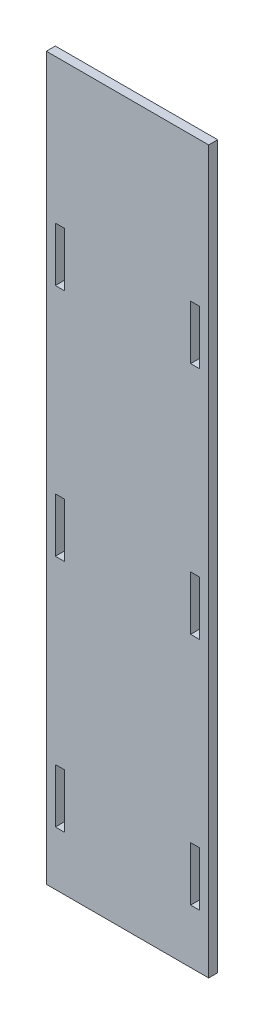
ISO-10303-21;
HEADER;
FILE_DESCRIPTION(('STEP AP214'),'2;1');
FILE_NAME('part.step','',(''),(''),'','','');
FILE_SCHEMA(('AUTOMOTIVE_DESIGN { 1 0 10303 214 1 1 1 1 }'));
ENDSEC;
DATA;
#1=APPLICATION_CONTEXT('core data for automotive mechanical design processes');
#2=APPLICATION_PROTOCOL_DEFINITION('international standard','automotive_design',2000,#1);
#3=PRODUCT_CONTEXT('',#1,'mechanical');
#4=PRODUCT('Part','Part','',(#3));
#5=PRODUCT_RELATED_PRODUCT_CATEGORY('part','',(#4));
#6=PRODUCT_DEFINITION_FORMATION('','',#4);
#7=PRODUCT_DEFINITION_CONTEXT('part definition',#1,'design');
#8=PRODUCT_DEFINITION('design','',#6,#7);
#9=PRODUCT_DEFINITION_SHAPE('','',#8);
#10=(LENGTH_UNIT() NAMED_UNIT(*) SI_UNIT(.MILLI.,.METRE.));
#11=(NAMED_UNIT(*) PLANE_ANGLE_UNIT() SI_UNIT($,.RADIAN.));
#12=(NAMED_UNIT(*) SI_UNIT($,.STERADIAN.) SOLID_ANGLE_UNIT());
#13=UNCERTAINTY_MEASURE_WITH_UNIT(LENGTH_MEASURE(1.E-05),#10,'distance_accuracy_value','');
#14=(GEOMETRIC_REPRESENTATION_CONTEXT(3) GLOBAL_UNCERTAINTY_ASSIGNED_CONTEXT((#13)) GLOBAL_UNIT_ASSIGNED_CONTEXT((#10,
#11,#12)) REPRESENTATION_CONTEXT('',''));
#15=CARTESIAN_POINT('',(0.,0.,0.));
#16=DIRECTION('',(0.,0.,1.));
#17=DIRECTION('',(1.,0.,0.));
#18=AXIS2_PLACEMENT_3D('',#15,#16,#17);
#19=CARTESIAN_POINT('',(0.,254.,3.175));
#20=DIRECTION('',(1.,0.,0.));
#21=DIRECTION('',(0.,0.,-1.));
#22=AXIS2_PLACEMENT_3D('',#19,#20,#21);
#23=PLANE('',#22);
#24=DIRECTION('',(0.,-1.,0.));
#25=VECTOR('',#24,1.);
#26=CARTESIAN_POINT('',(0.,254.,0.));
#27=LINE('',#26,#25);
#28=CARTESIAN_POINT('',(0.,254.,0.));
#29=VERTEX_POINT('',#28);
#30=CARTESIAN_POINT('',(0.,0.,0.));
#31=VERTEX_POINT('',#30);
#32=EDGE_CURVE('E406',#29,#31,#27,.T.);
#33=ORIENTED_EDGE('',*,*,#32,.T.);
#34=DIRECTION('',(0.,0.,-1.));
#35=VECTOR('',#34,1.);
#36=CARTESIAN_POINT('',(0.,0.,3.175));
#37=LINE('',#36,#35);
#38=CARTESIAN_POINT('',(0.,0.,3.175));
#39=VERTEX_POINT('',#38);
#40=EDGE_CURVE('E11',#39,#31,#37,.T.);
#41=ORIENTED_EDGE('',*,*,#40,.F.);
#42=DIRECTION('',(0.,-1.,0.));
#43=VECTOR('',#42,1.);
#44=CARTESIAN_POINT('',(0.,254.,3.175));
#45=LINE('',#44,#43);
#46=CARTESIAN_POINT('',(0.,254.,3.175));
#47=VERTEX_POINT('',#46);
#48=EDGE_CURVE('E413',#47,#39,#45,.T.);
#49=ORIENTED_EDGE('',*,*,#48,.F.);
#50=DIRECTION('',(0.,0.,-1.));
#51=VECTOR('',#50,1.);
#52=CARTESIAN_POINT('',(0.,254.,3.175));
#53=LINE('',#52,#51);
#54=EDGE_CURVE('E423',#47,#29,#53,.T.);
#55=ORIENTED_EDGE('',*,*,#54,.T.);
#56=EDGE_LOOP('',(#33,#41,#49,#55));
#57=FACE_BOUND('',#56,.T.);
#58=ADVANCED_FACE('F32',(#57),#23,.F.);
#59=CARTESIAN_POINT('',(0.,0.,3.175));
#60=DIRECTION('',(0.,1.,0.));
#61=DIRECTION('',(0.,0.,1.));
#62=AXIS2_PLACEMENT_3D('',#59,#60,#61);
#63=PLANE('',#62);
#64=DIRECTION('',(1.,0.,0.));
#65=VECTOR('',#64,1.);
#66=CARTESIAN_POINT('',(0.,0.,0.));
#67=LINE('',#66,#65);
#68=CARTESIAN_POINT('',(57.15,0.,0.));
#69=VERTEX_POINT('',#68);
#70=EDGE_CURVE('E426',#31,#69,#67,.T.);
#71=ORIENTED_EDGE('',*,*,#70,.T.);
#72=DIRECTION('',(0.,0.,-1.));
#73=VECTOR('',#72,1.);
#74=CARTESIAN_POINT('',(57.15,0.,3.175));
#75=LINE('',#74,#73);
#76=CARTESIAN_POINT('',(57.15,0.,3.175));
#77=VERTEX_POINT('',#76);
#78=EDGE_CURVE('E39',#77,#69,#75,.T.);
#79=ORIENTED_EDGE('',*,*,#78,.F.);
#80=DIRECTION('',(1.,0.,0.));
#81=VECTOR('',#80,1.);
#82=CARTESIAN_POINT('',(0.,0.,3.175));
#83=LINE('',#82,#81);
#84=EDGE_CURVE('E416',#39,#77,#83,.T.);
#85=ORIENTED_EDGE('',*,*,#84,.F.);
#86=ORIENTED_EDGE('',*,*,#40,.T.);
#87=EDGE_LOOP('',(#71,#79,#85,#86));
#88=FACE_BOUND('',#87,.T.);
#89=ADVANCED_FACE('F455',(#88),#63,.F.);
#90=CARTESIAN_POINT('',(57.1499999999999,254.,3.175));
#91=DIRECTION('',(-1.,0.,0.));
#92=DIRECTION('',(0.,-1.,0.));
#93=AXIS2_PLACEMENT_3D('',#90,#91,#92);
#94=PLANE('',#93);
#95=DIRECTION('',(0.,1.,0.));
#96=VECTOR('',#95,1.);
#97=CARTESIAN_POINT('',(57.1499999999999,254.,0.));
#98=LINE('',#97,#96);
#99=CARTESIAN_POINT('',(57.1499999999999,254.,0.));
#100=VERTEX_POINT('',#99);
#101=EDGE_CURVE('E428',#69,#100,#98,.T.);
#102=ORIENTED_EDGE('',*,*,#101,.T.);
#103=DIRECTION('',(0.,0.,-1.));
#104=VECTOR('',#103,1.);
#105=CARTESIAN_POINT('',(57.1499999999999,254.,3.175));
#106=LINE('',#105,#104);
#107=CARTESIAN_POINT('',(57.1499999999999,254.,3.175));
#108=VERTEX_POINT('',#107);
#109=EDGE_CURVE('E433',#108,#100,#106,.T.);
#110=ORIENTED_EDGE('',*,*,#109,.F.);
#111=DIRECTION('',(0.,1.,0.));
#112=VECTOR('',#111,1.);
#113=CARTESIAN_POINT('',(57.1499999999999,254.,3.175));
#114=LINE('',#113,#112);
#115=EDGE_CURVE('E419',#77,#108,#114,.T.);
#116=ORIENTED_EDGE('',*,*,#115,.F.);
#117=ORIENTED_EDGE('',*,*,#78,.T.);
#118=EDGE_LOOP('',(#102,#110,#116,#117));
#119=FACE_BOUND('',#118,.T.);
#120=ADVANCED_FACE('F440',(#119),#94,.F.);
#121=CARTESIAN_POINT('',(0.,254.,3.175));
#122=DIRECTION('',(0.,-1.,0.));
#123=DIRECTION('',(0.,0.,-1.));
#124=AXIS2_PLACEMENT_3D('',#121,#122,#123);
#125=PLANE('',#124);
#126=DIRECTION('',(-1.,0.,0.));
#127=VECTOR('',#126,1.);
#128=CARTESIAN_POINT('',(0.,254.,0.));
#129=LINE('',#128,#127);
#130=EDGE_CURVE('E417',#100,#29,#129,.T.);
#131=ORIENTED_EDGE('',*,*,#130,.T.);
#132=ORIENTED_EDGE('',*,*,#54,.F.);
#133=DIRECTION('',(-1.,0.,0.));
#134=VECTOR('',#133,1.);
#135=CARTESIAN_POINT('',(0.,254.,3.175));
#136=LINE('',#135,#134);
#137=EDGE_CURVE('E421',#108,#47,#136,.T.);
#138=ORIENTED_EDGE('',*,*,#137,.F.);
#139=ORIENTED_EDGE('',*,*,#109,.T.);
#140=EDGE_LOOP('',(#131,#132,#138,#139));
#141=FACE_BOUND('',#140,.T.);
#142=ADVANCED_FACE('F448',(#141),#125,.F.);
#143=CARTESIAN_POINT('',(0.,0.,3.175));
#144=DIRECTION('',(0.,0.,1.));
#145=DIRECTION('',(1.,0.,0.));
#146=AXIS2_PLACEMENT_3D('',#143,#144,#145);
#147=PLANE('',#146);
#148=DIRECTION('',(0.,-1.,0.));
#149=VECTOR('',#148,1.);
#150=CARTESIAN_POINT('',(50.8,38.1,3.175));
#151=LINE('',#150,#149);
#152=CARTESIAN_POINT('',(50.8,38.1,3.175));
#153=VERTEX_POINT('',#152);
#154=CARTESIAN_POINT('',(50.8,19.05,3.175));
#155=VERTEX_POINT('',#154);
#156=EDGE_CURVE('E46',#153,#155,#151,.T.);
#157=ORIENTED_EDGE('',*,*,#156,.F.);
#158=DIRECTION('',(-1.,0.,0.));
#159=VECTOR('',#158,1.);
#160=CARTESIAN_POINT('',(50.8,38.1,3.175));
#161=LINE('',#160,#159);
#162=CARTESIAN_POINT('',(53.975,38.1,3.175));
#163=VERTEX_POINT('',#162);
#164=EDGE_CURVE('E234',#163,#153,#161,.T.);
#165=ORIENTED_EDGE('',*,*,#164,.F.);
#166=DIRECTION('',(0.,1.,0.));
#167=VECTOR('',#166,1.);
#168=CARTESIAN_POINT('',(53.975,38.1,3.175));
#169=LINE('',#168,#167);
#170=CARTESIAN_POINT('',(53.975,19.05,3.175));
#171=VERTEX_POINT('',#170);
#172=EDGE_CURVE('E237',#171,#163,#169,.T.);
#173=ORIENTED_EDGE('',*,*,#172,.F.);
#174=DIRECTION('',(1.,0.,0.));
#175=VECTOR('',#174,1.);
#176=CARTESIAN_POINT('',(50.8,19.05,3.175));
#177=LINE('',#176,#175);
#178=EDGE_CURVE('E243',#155,#171,#177,.T.);
#179=ORIENTED_EDGE('',*,*,#178,.F.);
#180=EDGE_LOOP('',(#157,#165,#173,#179));
#181=FACE_BOUND('',#180,.T.);
#182=DIRECTION('',(0.,-1.,0.));
#183=VECTOR('',#182,1.);
#184=CARTESIAN_POINT('',(50.8,120.65,3.175));
#185=LINE('',#184,#183);
#186=CARTESIAN_POINT('',(50.8,120.65,3.175));
#187=VERTEX_POINT('',#186);
#188=CARTESIAN_POINT('',(50.8,101.6,3.175));
#189=VERTEX_POINT('',#188);
#190=EDGE_CURVE('E249',#187,#189,#185,.T.);
#191=ORIENTED_EDGE('',*,*,#190,.F.);
#192=DIRECTION('',(-1.,0.,0.));
#193=VECTOR('',#192,1.);
#194=CARTESIAN_POINT('',(50.8,120.65,3.175));
#195=LINE('',#194,#193);
#196=CARTESIAN_POINT('',(53.975,120.65,3.175));
#197=VERTEX_POINT('',#196);
#198=EDGE_CURVE('E257',#197,#187,#195,.T.);
#199=ORIENTED_EDGE('',*,*,#198,.F.);
#200=DIRECTION('',(0.,1.,0.));
#201=VECTOR('',#200,1.);
#202=CARTESIAN_POINT('',(53.975,120.65,3.175));
#203=LINE('',#202,#201);
#204=CARTESIAN_POINT('',(53.975,101.6,3.175));
#205=VERTEX_POINT('',#204);
#206=EDGE_CURVE('E271',#205,#197,#203,.T.);
#207=ORIENTED_EDGE('',*,*,#206,.F.);
#208=DIRECTION('',(1.,0.,0.));
#209=VECTOR('',#208,1.);
#210=CARTESIAN_POINT('',(50.8,101.6,3.175));
#211=LINE('',#210,#209);
#212=EDGE_CURVE('E268',#189,#205,#211,.T.);
#213=ORIENTED_EDGE('',*,*,#212,.F.);
#214=EDGE_LOOP('',(#191,#199,#207,#213));
#215=FACE_BOUND('',#214,.T.);
#216=DIRECTION('',(0.,-1.,0.));
#217=VECTOR('',#216,1.);
#218=CARTESIAN_POINT('',(50.8,203.2,3.175));
#219=LINE('',#218,#217);
#220=CARTESIAN_POINT('',(50.8,203.2,3.175));
#221=VERTEX_POINT('',#220);
#222=CARTESIAN_POINT('',(50.8,184.15,3.175));
#223=VERTEX_POINT('',#222);
#224=EDGE_CURVE('E278',#221,#223,#219,.T.);
#225=ORIENTED_EDGE('',*,*,#224,.F.);
#226=DIRECTION('',(-1.,0.,0.));
#227=VECTOR('',#226,1.);
#228=CARTESIAN_POINT('',(50.8,203.2,3.175));
#229=LINE('',#228,#227);
#230=CARTESIAN_POINT('',(53.975,203.2,3.175));
#231=VERTEX_POINT('',#230);
#232=EDGE_CURVE('E289',#231,#221,#229,.T.);
#233=ORIENTED_EDGE('',*,*,#232,.F.);
#234=DIRECTION('',(0.,1.,0.));
#235=VECTOR('',#234,1.);
#236=CARTESIAN_POINT('',(53.975,203.2,3.175));
#237=LINE('',#236,#235);
#238=CARTESIAN_POINT('',(53.975,184.15,3.175));
#239=VERTEX_POINT('',#238);
#240=EDGE_CURVE('E303',#239,#231,#237,.T.);
#241=ORIENTED_EDGE('',*,*,#240,.F.);
#242=DIRECTION('',(1.,0.,0.));
#243=VECTOR('',#242,1.);
#244=CARTESIAN_POINT('',(50.8,184.15,3.175));
#245=LINE('',#244,#243);
#246=EDGE_CURVE('E300',#223,#239,#245,.T.);
#247=ORIENTED_EDGE('',*,*,#246,.F.);
#248=EDGE_LOOP('',(#225,#233,#241,#247));
#249=FACE_BOUND('',#248,.T.);
#250=DIRECTION('',(0.,-1.,0.));
#251=VECTOR('',#250,1.);
#252=CARTESIAN_POINT('',(3.175,38.1,3.175));
#253=LINE('',#252,#251);
#254=CARTESIAN_POINT('',(3.175,38.1,3.175));
#255=VERTEX_POINT('',#254);
#256=CARTESIAN_POINT('',(3.175,19.05,3.175));
#257=VERTEX_POINT('',#256);
#258=EDGE_CURVE('E310',#255,#257,#253,.T.);
#259=ORIENTED_EDGE('',*,*,#258,.F.);
#260=DIRECTION('',(-1.,0.,0.));
#261=VECTOR('',#260,1.);
#262=CARTESIAN_POINT('',(3.175,38.1,3.175));
#263=LINE('',#262,#261);
#264=CARTESIAN_POINT('',(6.35,38.1,3.175));
#265=VERTEX_POINT('',#264);
#266=EDGE_CURVE('E321',#265,#255,#263,.T.);
#267=ORIENTED_EDGE('',*,*,#266,.F.);
#268=DIRECTION('',(0.,1.,0.));
#269=VECTOR('',#268,1.);
#270=CARTESIAN_POINT('',(6.35,38.1,3.175));
#271=LINE('',#270,#269);
#272=CARTESIAN_POINT('',(6.35,19.05,3.175));
#273=VERTEX_POINT('',#272);
#274=EDGE_CURVE('E335',#273,#265,#271,.T.);
#275=ORIENTED_EDGE('',*,*,#274,.F.);
#276=DIRECTION('',(1.,0.,0.));
#277=VECTOR('',#276,1.);
#278=CARTESIAN_POINT('',(3.175,19.05,3.175));
#279=LINE('',#278,#277);
#280=EDGE_CURVE('E332',#257,#273,#279,.T.);
#281=ORIENTED_EDGE('',*,*,#280,.F.);
#282=EDGE_LOOP('',(#259,#267,#275,#281));
#283=FACE_BOUND('',#282,.T.);
#284=DIRECTION('',(0.,-1.,0.));
#285=VECTOR('',#284,1.);
#286=CARTESIAN_POINT('',(3.17499999999999,120.65,3.175));
#287=LINE('',#286,#285);
#288=CARTESIAN_POINT('',(3.17499999999999,120.65,3.175));
#289=VERTEX_POINT('',#288);
#290=CARTESIAN_POINT('',(3.17499999999999,101.6,3.175));
#291=VERTEX_POINT('',#290);
#292=EDGE_CURVE('E342',#289,#291,#287,.T.);
#293=ORIENTED_EDGE('',*,*,#292,.F.);
#294=DIRECTION('',(-1.,0.,0.));
#295=VECTOR('',#294,1.);
#296=CARTESIAN_POINT('',(3.17499999999999,120.65,3.175));
#297=LINE('',#296,#295);
#298=CARTESIAN_POINT('',(6.34999999999999,120.65,3.175));
#299=VERTEX_POINT('',#298);
#300=EDGE_CURVE('E353',#299,#289,#297,.T.);
#301=ORIENTED_EDGE('',*,*,#300,.F.);
#302=DIRECTION('',(0.,1.,0.));
#303=VECTOR('',#302,1.);
#304=CARTESIAN_POINT('',(6.34999999999999,120.65,3.175));
#305=LINE('',#304,#303);
#306=CARTESIAN_POINT('',(6.34999999999999,101.6,3.175));
#307=VERTEX_POINT('',#306);
#308=EDGE_CURVE('E367',#307,#299,#305,.T.);
#309=ORIENTED_EDGE('',*,*,#308,.F.);
#310=DIRECTION('',(1.,0.,0.));
#311=VECTOR('',#310,1.);
#312=CARTESIAN_POINT('',(3.17499999999999,101.6,3.175));
#313=LINE('',#312,#311);
#314=EDGE_CURVE('E364',#291,#307,#313,.T.);
#315=ORIENTED_EDGE('',*,*,#314,.F.);
#316=EDGE_LOOP('',(#293,#301,#309,#315));
#317=FACE_BOUND('',#316,.T.);
#318=DIRECTION('',(0.,-1.,0.));
#319=VECTOR('',#318,1.);
#320=CARTESIAN_POINT('',(3.17499999999998,203.2,3.175));
#321=LINE('',#320,#319);
#322=CARTESIAN_POINT('',(3.17499999999998,203.2,3.175));
#323=VERTEX_POINT('',#322);
#324=CARTESIAN_POINT('',(3.17499999999998,184.15,3.175));
#325=VERTEX_POINT('',#324);
#326=EDGE_CURVE('E374',#323,#325,#321,.T.);
#327=ORIENTED_EDGE('',*,*,#326,.F.);
#328=DIRECTION('',(-1.,0.,0.));
#329=VECTOR('',#328,1.);
#330=CARTESIAN_POINT('',(3.17499999999998,203.2,3.175));
#331=LINE('',#330,#329);
#332=CARTESIAN_POINT('',(6.34999999999998,203.2,3.175));
#333=VERTEX_POINT('',#332);
#334=EDGE_CURVE('E385',#333,#323,#331,.T.);
#335=ORIENTED_EDGE('',*,*,#334,.F.);
#336=DIRECTION('',(0.,1.,0.));
#337=VECTOR('',#336,1.);
#338=CARTESIAN_POINT('',(6.34999999999998,203.2,3.175));
#339=LINE('',#338,#337);
#340=CARTESIAN_POINT('',(6.34999999999998,184.15,3.175));
#341=VERTEX_POINT('',#340);
#342=EDGE_CURVE('E399',#341,#333,#339,.T.);
#343=ORIENTED_EDGE('',*,*,#342,.F.);
#344=DIRECTION('',(1.,0.,0.));
#345=VECTOR('',#344,1.);
#346=CARTESIAN_POINT('',(3.17499999999998,184.15,3.175));
#347=LINE('',#346,#345);
#348=EDGE_CURVE('E396',#325,#341,#347,.T.);
#349=ORIENTED_EDGE('',*,*,#348,.F.);
#350=EDGE_LOOP('',(#327,#335,#343,#349));
#351=FACE_BOUND('',#350,.T.);
#352=ORIENTED_EDGE('',*,*,#48,.T.);
#353=ORIENTED_EDGE('',*,*,#84,.T.);
#354=ORIENTED_EDGE('',*,*,#115,.T.);
#355=ORIENTED_EDGE('',*,*,#137,.T.);
#356=EDGE_LOOP('',(#352,#353,#354,#355));
#357=FACE_BOUND('',#356,.T.);
#358=ADVANCED_FACE('F454',(#181,#215,#249,#283,#317,#351,#357),#147,.T.);
#359=CARTESIAN_POINT('',(0.,0.,0.));
#360=DIRECTION('',(0.,0.,1.));
#361=DIRECTION('',(1.,0.,0.));
#362=AXIS2_PLACEMENT_3D('',#359,#360,#361);
#363=PLANE('',#362);
#364=DIRECTION('',(-1.,0.,0.));
#365=VECTOR('',#364,1.);
#366=CARTESIAN_POINT('',(50.8,38.1,0.));
#367=LINE('',#366,#365);
#368=CARTESIAN_POINT('',(53.975,38.1,0.));
#369=VERTEX_POINT('',#368);
#370=CARTESIAN_POINT('',(50.8,38.1,0.));
#371=VERTEX_POINT('',#370);
#372=EDGE_CURVE('E224',#369,#371,#367,.T.);
#373=ORIENTED_EDGE('',*,*,#372,.T.);
#374=DIRECTION('',(0.,-1.,0.));
#375=VECTOR('',#374,1.);
#376=CARTESIAN_POINT('',(50.8,38.1,0.));
#377=LINE('',#376,#375);
#378=CARTESIAN_POINT('',(50.8,19.05,0.));
#379=VERTEX_POINT('',#378);
#380=EDGE_CURVE('E218',#371,#379,#377,.T.);
#381=ORIENTED_EDGE('',*,*,#380,.T.);
#382=DIRECTION('',(1.,0.,0.));
#383=VECTOR('',#382,1.);
#384=CARTESIAN_POINT('',(50.8,19.05,0.));
#385=LINE('',#384,#383);
#386=CARTESIAN_POINT('',(53.975,19.05,0.));
#387=VERTEX_POINT('',#386);
#388=EDGE_CURVE('E227',#379,#387,#385,.T.);
#389=ORIENTED_EDGE('',*,*,#388,.T.);
#390=DIRECTION('',(0.,1.,0.));
#391=VECTOR('',#390,1.);
#392=CARTESIAN_POINT('',(53.975,38.1,0.));
#393=LINE('',#392,#391);
#394=EDGE_CURVE('E54',#387,#369,#393,.T.);
#395=ORIENTED_EDGE('',*,*,#394,.T.);
#396=EDGE_LOOP('',(#373,#381,#389,#395));
#397=FACE_BOUND('',#396,.T.);
#398=DIRECTION('',(-1.,0.,0.));
#399=VECTOR('',#398,1.);
#400=CARTESIAN_POINT('',(50.8,120.65,0.));
#401=LINE('',#400,#399);
#402=CARTESIAN_POINT('',(53.975,120.65,0.));
#403=VERTEX_POINT('',#402);
#404=CARTESIAN_POINT('',(50.8,120.65,0.));
#405=VERTEX_POINT('',#404);
#406=EDGE_CURVE('E263',#403,#405,#401,.T.);
#407=ORIENTED_EDGE('',*,*,#406,.T.);
#408=DIRECTION('',(0.,-1.,0.));
#409=VECTOR('',#408,1.);
#410=CARTESIAN_POINT('',(50.8,120.65,0.));
#411=LINE('',#410,#409);
#412=CARTESIAN_POINT('',(50.8,101.6,0.));
#413=VERTEX_POINT('',#412);
#414=EDGE_CURVE('E253',#405,#413,#411,.T.);
#415=ORIENTED_EDGE('',*,*,#414,.T.);
#416=DIRECTION('',(1.,0.,0.));
#417=VECTOR('',#416,1.);
#418=CARTESIAN_POINT('',(50.8,101.6,0.));
#419=LINE('',#418,#417);
#420=CARTESIAN_POINT('',(53.975,101.6,0.));
#421=VERTEX_POINT('',#420);
#422=EDGE_CURVE('E256',#413,#421,#419,.T.);
#423=ORIENTED_EDGE('',*,*,#422,.T.);
#424=DIRECTION('',(0.,1.,0.));
#425=VECTOR('',#424,1.);
#426=CARTESIAN_POINT('',(53.975,120.65,0.));
#427=LINE('',#426,#425);
#428=EDGE_CURVE('E260',#421,#403,#427,.T.);
#429=ORIENTED_EDGE('',*,*,#428,.T.);
#430=EDGE_LOOP('',(#407,#415,#423,#429));
#431=FACE_BOUND('',#430,.T.);
#432=DIRECTION('',(-1.,0.,0.));
#433=VECTOR('',#432,1.);
#434=CARTESIAN_POINT('',(50.8,203.2,0.));
#435=LINE('',#434,#433);
#436=CARTESIAN_POINT('',(53.975,203.2,0.));
#437=VERTEX_POINT('',#436);
#438=CARTESIAN_POINT('',(50.8,203.2,0.));
#439=VERTEX_POINT('',#438);
#440=EDGE_CURVE('E295',#437,#439,#435,.T.);
#441=ORIENTED_EDGE('',*,*,#440,.T.);
#442=DIRECTION('',(0.,-1.,0.));
#443=VECTOR('',#442,1.);
#444=CARTESIAN_POINT('',(50.8,203.2,0.));
#445=LINE('',#444,#443);
#446=CARTESIAN_POINT('',(50.8,184.15,0.));
#447=VERTEX_POINT('',#446);
#448=EDGE_CURVE('E285',#439,#447,#445,.T.);
#449=ORIENTED_EDGE('',*,*,#448,.T.);
#450=DIRECTION('',(1.,0.,0.));
#451=VECTOR('',#450,1.);
#452=CARTESIAN_POINT('',(50.8,184.15,0.));
#453=LINE('',#452,#451);
#454=CARTESIAN_POINT('',(53.975,184.15,0.));
#455=VERTEX_POINT('',#454);
#456=EDGE_CURVE('E288',#447,#455,#453,.T.);
#457=ORIENTED_EDGE('',*,*,#456,.T.);
#458=DIRECTION('',(0.,1.,0.));
#459=VECTOR('',#458,1.);
#460=CARTESIAN_POINT('',(53.975,203.2,0.));
#461=LINE('',#460,#459);
#462=EDGE_CURVE('E292',#455,#437,#461,.T.);
#463=ORIENTED_EDGE('',*,*,#462,.T.);
#464=EDGE_LOOP('',(#441,#449,#457,#463));
#465=FACE_BOUND('',#464,.T.);
#466=DIRECTION('',(-1.,0.,0.));
#467=VECTOR('',#466,1.);
#468=CARTESIAN_POINT('',(3.175,38.1,0.));
#469=LINE('',#468,#467);
#470=CARTESIAN_POINT('',(6.35,38.1,0.));
#471=VERTEX_POINT('',#470);
#472=CARTESIAN_POINT('',(3.175,38.1,0.));
#473=VERTEX_POINT('',#472);
#474=EDGE_CURVE('E327',#471,#473,#469,.T.);
#475=ORIENTED_EDGE('',*,*,#474,.T.);
#476=DIRECTION('',(0.,-1.,0.));
#477=VECTOR('',#476,1.);
#478=CARTESIAN_POINT('',(3.175,38.1,0.));
#479=LINE('',#478,#477);
#480=CARTESIAN_POINT('',(3.175,19.05,0.));
#481=VERTEX_POINT('',#480);
#482=EDGE_CURVE('E317',#473,#481,#479,.T.);
#483=ORIENTED_EDGE('',*,*,#482,.T.);
#484=DIRECTION('',(1.,0.,0.));
#485=VECTOR('',#484,1.);
#486=CARTESIAN_POINT('',(3.175,19.05,0.));
#487=LINE('',#486,#485);
#488=CARTESIAN_POINT('',(6.35,19.05,0.));
#489=VERTEX_POINT('',#488);
#490=EDGE_CURVE('E320',#481,#489,#487,.T.);
#491=ORIENTED_EDGE('',*,*,#490,.T.);
#492=DIRECTION('',(0.,1.,0.));
#493=VECTOR('',#492,1.);
#494=CARTESIAN_POINT('',(6.35,38.1,0.));
#495=LINE('',#494,#493);
#496=EDGE_CURVE('E324',#489,#471,#495,.T.);
#497=ORIENTED_EDGE('',*,*,#496,.T.);
#498=EDGE_LOOP('',(#475,#483,#491,#497));
#499=FACE_BOUND('',#498,.T.);
#500=DIRECTION('',(-1.,0.,0.));
#501=VECTOR('',#500,1.);
#502=CARTESIAN_POINT('',(3.17499999999999,120.65,0.));
#503=LINE('',#502,#501);
#504=CARTESIAN_POINT('',(6.34999999999999,120.65,0.));
#505=VERTEX_POINT('',#504);
#506=CARTESIAN_POINT('',(3.17499999999999,120.65,0.));
#507=VERTEX_POINT('',#506);
#508=EDGE_CURVE('E359',#505,#507,#503,.T.);
#509=ORIENTED_EDGE('',*,*,#508,.T.);
#510=DIRECTION('',(0.,-1.,0.));
#511=VECTOR('',#510,1.);
#512=CARTESIAN_POINT('',(3.17499999999999,120.65,0.));
#513=LINE('',#512,#511);
#514=CARTESIAN_POINT('',(3.17499999999999,101.6,0.));
#515=VERTEX_POINT('',#514);
#516=EDGE_CURVE('E349',#507,#515,#513,.T.);
#517=ORIENTED_EDGE('',*,*,#516,.T.);
#518=DIRECTION('',(1.,0.,0.));
#519=VECTOR('',#518,1.);
#520=CARTESIAN_POINT('',(3.17499999999999,101.6,0.));
#521=LINE('',#520,#519);
#522=CARTESIAN_POINT('',(6.34999999999999,101.6,0.));
#523=VERTEX_POINT('',#522);
#524=EDGE_CURVE('E352',#515,#523,#521,.T.);
#525=ORIENTED_EDGE('',*,*,#524,.T.);
#526=DIRECTION('',(0.,1.,0.));
#527=VECTOR('',#526,1.);
#528=CARTESIAN_POINT('',(6.34999999999999,120.65,0.));
#529=LINE('',#528,#527);
#530=EDGE_CURVE('E356',#523,#505,#529,.T.);
#531=ORIENTED_EDGE('',*,*,#530,.T.);
#532=EDGE_LOOP('',(#509,#517,#525,#531));
#533=FACE_BOUND('',#532,.T.);
#534=DIRECTION('',(-1.,0.,0.));
#535=VECTOR('',#534,1.);
#536=CARTESIAN_POINT('',(3.17499999999998,203.2,0.));
#537=LINE('',#536,#535);
#538=CARTESIAN_POINT('',(6.34999999999998,203.2,0.));
#539=VERTEX_POINT('',#538);
#540=CARTESIAN_POINT('',(3.17499999999998,203.2,0.));
#541=VERTEX_POINT('',#540);
#542=EDGE_CURVE('E391',#539,#541,#537,.T.);
#543=ORIENTED_EDGE('',*,*,#542,.T.);
#544=DIRECTION('',(0.,-1.,0.));
#545=VECTOR('',#544,1.);
#546=CARTESIAN_POINT('',(3.17499999999998,203.2,0.));
#547=LINE('',#546,#545);
#548=CARTESIAN_POINT('',(3.17499999999998,184.15,0.));
#549=VERTEX_POINT('',#548);
#550=EDGE_CURVE('E381',#541,#549,#547,.T.);
#551=ORIENTED_EDGE('',*,*,#550,.T.);
#552=DIRECTION('',(1.,0.,0.));
#553=VECTOR('',#552,1.);
#554=CARTESIAN_POINT('',(3.17499999999998,184.15,0.));
#555=LINE('',#554,#553);
#556=CARTESIAN_POINT('',(6.34999999999998,184.15,0.));
#557=VERTEX_POINT('',#556);
#558=EDGE_CURVE('E384',#549,#557,#555,.T.);
#559=ORIENTED_EDGE('',*,*,#558,.T.);
#560=DIRECTION('',(0.,1.,0.));
#561=VECTOR('',#560,1.);
#562=CARTESIAN_POINT('',(6.34999999999998,203.2,0.));
#563=LINE('',#562,#561);
#564=EDGE_CURVE('E388',#557,#539,#563,.T.);
#565=ORIENTED_EDGE('',*,*,#564,.T.);
#566=EDGE_LOOP('',(#543,#551,#559,#565));
#567=FACE_BOUND('',#566,.T.);
#568=ORIENTED_EDGE('',*,*,#32,.F.);
#569=ORIENTED_EDGE('',*,*,#130,.F.);
#570=ORIENTED_EDGE('',*,*,#101,.F.);
#571=ORIENTED_EDGE('',*,*,#70,.F.);
#572=EDGE_LOOP('',(#568,#569,#570,#571));
#573=FACE_BOUND('',#572,.T.);
#574=ADVANCED_FACE('F231',(#397,#431,#465,#499,#533,#567,#573),#363,.F.);
#575=CARTESIAN_POINT('',(3.17499999999998,203.2,0.));
#576=DIRECTION('',(-1.,0.,0.));
#577=DIRECTION('',(0.,-1.,0.));
#578=AXIS2_PLACEMENT_3D('',#575,#576,#577);
#579=PLANE('',#578);
#580=ORIENTED_EDGE('',*,*,#326,.T.);
#581=DIRECTION('',(0.,0.,1.));
#582=VECTOR('',#581,1.);
#583=CARTESIAN_POINT('',(3.17499999999998,184.15,0.));
#584=LINE('',#583,#582);
#585=EDGE_CURVE('E394',#549,#325,#584,.T.);
#586=ORIENTED_EDGE('',*,*,#585,.F.);
#587=ORIENTED_EDGE('',*,*,#550,.F.);
#588=DIRECTION('',(0.,0.,1.));
#589=VECTOR('',#588,1.);
#590=CARTESIAN_POINT('',(3.17499999999998,203.2,0.));
#591=LINE('',#590,#589);
#592=EDGE_CURVE('E404',#541,#323,#591,.T.);
#593=ORIENTED_EDGE('',*,*,#592,.T.);
#594=EDGE_LOOP('',(#580,#586,#587,#593));
#595=FACE_BOUND('',#594,.T.);
#596=ADVANCED_FACE('F467',(#595),#579,.F.);
#597=CARTESIAN_POINT('',(3.17499999999998,203.2,0.));
#598=DIRECTION('',(0.,1.,0.));
#599=DIRECTION('',(0.,0.,1.));
#600=AXIS2_PLACEMENT_3D('',#597,#598,#599);
#601=PLANE('',#600);
#602=ORIENTED_EDGE('',*,*,#334,.T.);
#603=ORIENTED_EDGE('',*,*,#592,.F.);
#604=ORIENTED_EDGE('',*,*,#542,.F.);
#605=DIRECTION('',(0.,0.,1.));
#606=VECTOR('',#605,1.);
#607=CARTESIAN_POINT('',(6.34999999999998,203.2,0.));
#608=LINE('',#607,#606);
#609=EDGE_CURVE('E407',#539,#333,#608,.T.);
#610=ORIENTED_EDGE('',*,*,#609,.T.);
#611=EDGE_LOOP('',(#602,#603,#604,#610));
#612=FACE_BOUND('',#611,.T.);
#613=ADVANCED_FACE('F473',(#612),#601,.F.);
#614=CARTESIAN_POINT('',(6.34999999999998,203.2,0.));
#615=DIRECTION('',(1.,0.,0.));
#616=DIRECTION('',(0.,1.,0.));
#617=AXIS2_PLACEMENT_3D('',#614,#615,#616);
#618=PLANE('',#617);
#619=ORIENTED_EDGE('',*,*,#342,.T.);
#620=ORIENTED_EDGE('',*,*,#609,.F.);
#621=ORIENTED_EDGE('',*,*,#564,.F.);
#622=DIRECTION('',(0.,0.,1.));
#623=VECTOR('',#622,1.);
#624=CARTESIAN_POINT('',(6.34999999999998,184.15,0.));
#625=LINE('',#624,#623);
#626=EDGE_CURVE('E409',#557,#341,#625,.T.);
#627=ORIENTED_EDGE('',*,*,#626,.T.);
#628=EDGE_LOOP('',(#619,#620,#621,#627));
#629=FACE_BOUND('',#628,.T.);
#630=ADVANCED_FACE('F479',(#629),#618,.F.);
#631=CARTESIAN_POINT('',(3.17499999999998,184.15,0.));
#632=DIRECTION('',(0.,-1.,0.));
#633=DIRECTION('',(0.,0.,-1.));
#634=AXIS2_PLACEMENT_3D('',#631,#632,#633);
#635=PLANE('',#634);
#636=ORIENTED_EDGE('',*,*,#348,.T.);
#637=ORIENTED_EDGE('',*,*,#626,.F.);
#638=ORIENTED_EDGE('',*,*,#558,.F.);
#639=ORIENTED_EDGE('',*,*,#585,.T.);
#640=EDGE_LOOP('',(#636,#637,#638,#639));
#641=FACE_BOUND('',#640,.T.);
#642=ADVANCED_FACE('F475',(#641),#635,.F.);
#643=CARTESIAN_POINT('',(3.17499999999999,120.65,0.));
#644=DIRECTION('',(-1.,0.,0.));
#645=DIRECTION('',(0.,-1.,0.));
#646=AXIS2_PLACEMENT_3D('',#643,#644,#645);
#647=PLANE('',#646);
#648=ORIENTED_EDGE('',*,*,#292,.T.);
#649=DIRECTION('',(0.,0.,1.));
#650=VECTOR('',#649,1.);
#651=CARTESIAN_POINT('',(3.17499999999999,101.6,0.));
#652=LINE('',#651,#650);
#653=EDGE_CURVE('E362',#515,#291,#652,.T.);
#654=ORIENTED_EDGE('',*,*,#653,.F.);
#655=ORIENTED_EDGE('',*,*,#516,.F.);
#656=DIRECTION('',(0.,0.,1.));
#657=VECTOR('',#656,1.);
#658=CARTESIAN_POINT('',(3.17499999999999,120.65,0.));
#659=LINE('',#658,#657);
#660=EDGE_CURVE('E372',#507,#289,#659,.T.);
#661=ORIENTED_EDGE('',*,*,#660,.T.);
#662=EDGE_LOOP('',(#648,#654,#655,#661));
#663=FACE_BOUND('',#662,.T.);
#664=ADVANCED_FACE('F478',(#663),#647,.F.);
#665=CARTESIAN_POINT('',(3.17499999999999,120.65,0.));
#666=DIRECTION('',(0.,1.,0.));
#667=DIRECTION('',(0.,0.,1.));
#668=AXIS2_PLACEMENT_3D('',#665,#666,#667);
#669=PLANE('',#668);
#670=ORIENTED_EDGE('',*,*,#300,.T.);
#671=ORIENTED_EDGE('',*,*,#660,.F.);
#672=ORIENTED_EDGE('',*,*,#508,.F.);
#673=DIRECTION('',(0.,0.,1.));
#674=VECTOR('',#673,1.);
#675=CARTESIAN_POINT('',(6.34999999999999,120.65,0.));
#676=LINE('',#675,#674);
#677=EDGE_CURVE('E375',#505,#299,#676,.T.);
#678=ORIENTED_EDGE('',*,*,#677,.T.);
#679=EDGE_LOOP('',(#670,#671,#672,#678));
#680=FACE_BOUND('',#679,.T.);
#681=ADVANCED_FACE('F489',(#680),#669,.F.);
#682=CARTESIAN_POINT('',(6.34999999999999,120.65,0.));
#683=DIRECTION('',(1.,0.,0.));
#684=DIRECTION('',(0.,1.,0.));
#685=AXIS2_PLACEMENT_3D('',#682,#683,#684);
#686=PLANE('',#685);
#687=ORIENTED_EDGE('',*,*,#308,.T.);
#688=ORIENTED_EDGE('',*,*,#677,.F.);
#689=ORIENTED_EDGE('',*,*,#530,.F.);
#690=DIRECTION('',(0.,0.,1.));
#691=VECTOR('',#690,1.);
#692=CARTESIAN_POINT('',(6.34999999999999,101.6,0.));
#693=LINE('',#692,#691);
#694=EDGE_CURVE('E377',#523,#307,#693,.T.);
#695=ORIENTED_EDGE('',*,*,#694,.T.);
#696=EDGE_LOOP('',(#687,#688,#689,#695));
#697=FACE_BOUND('',#696,.T.);
#698=ADVANCED_FACE('F495',(#697),#686,.F.);
#699=CARTESIAN_POINT('',(3.17499999999999,101.6,0.));
#700=DIRECTION('',(0.,-1.,0.));
#701=DIRECTION('',(0.,0.,-1.));
#702=AXIS2_PLACEMENT_3D('',#699,#700,#701);
#703=PLANE('',#702);
#704=ORIENTED_EDGE('',*,*,#314,.T.);
#705=ORIENTED_EDGE('',*,*,#694,.F.);
#706=ORIENTED_EDGE('',*,*,#524,.F.);
#707=ORIENTED_EDGE('',*,*,#653,.T.);
#708=EDGE_LOOP('',(#704,#705,#706,#707));
#709=FACE_BOUND('',#708,.T.);
#710=ADVANCED_FACE('F491',(#709),#703,.F.);
#711=CARTESIAN_POINT('',(3.175,38.1,0.));
#712=DIRECTION('',(-1.,0.,0.));
#713=DIRECTION('',(0.,-1.,0.));
#714=AXIS2_PLACEMENT_3D('',#711,#712,#713);
#715=PLANE('',#714);
#716=ORIENTED_EDGE('',*,*,#258,.T.);
#717=DIRECTION('',(0.,0.,1.));
#718=VECTOR('',#717,1.);
#719=CARTESIAN_POINT('',(3.175,19.05,0.));
#720=LINE('',#719,#718);
#721=EDGE_CURVE('E330',#481,#257,#720,.T.);
#722=ORIENTED_EDGE('',*,*,#721,.F.);
#723=ORIENTED_EDGE('',*,*,#482,.F.);
#724=DIRECTION('',(0.,0.,1.));
#725=VECTOR('',#724,1.);
#726=CARTESIAN_POINT('',(3.175,38.1,0.));
#727=LINE('',#726,#725);
#728=EDGE_CURVE('E340',#473,#255,#727,.T.);
#729=ORIENTED_EDGE('',*,*,#728,.T.);
#730=EDGE_LOOP('',(#716,#722,#723,#729));
#731=FACE_BOUND('',#730,.T.);
#732=ADVANCED_FACE('F494',(#731),#715,.F.);
#733=CARTESIAN_POINT('',(3.175,38.1,0.));
#734=DIRECTION('',(0.,1.,0.));
#735=DIRECTION('',(0.,0.,1.));
#736=AXIS2_PLACEMENT_3D('',#733,#734,#735);
#737=PLANE('',#736);
#738=ORIENTED_EDGE('',*,*,#266,.T.);
#739=ORIENTED_EDGE('',*,*,#728,.F.);
#740=ORIENTED_EDGE('',*,*,#474,.F.);
#741=DIRECTION('',(0.,0.,1.));
#742=VECTOR('',#741,1.);
#743=CARTESIAN_POINT('',(6.35,38.1,0.));
#744=LINE('',#743,#742);
#745=EDGE_CURVE('E343',#471,#265,#744,.T.);
#746=ORIENTED_EDGE('',*,*,#745,.T.);
#747=EDGE_LOOP('',(#738,#739,#740,#746));
#748=FACE_BOUND('',#747,.T.);
#749=ADVANCED_FACE('F505',(#748),#737,.F.);
#750=CARTESIAN_POINT('',(6.35,38.1,0.));
#751=DIRECTION('',(1.,0.,0.));
#752=DIRECTION('',(0.,1.,0.));
#753=AXIS2_PLACEMENT_3D('',#750,#751,#752);
#754=PLANE('',#753);
#755=ORIENTED_EDGE('',*,*,#274,.T.);
#756=ORIENTED_EDGE('',*,*,#745,.F.);
#757=ORIENTED_EDGE('',*,*,#496,.F.);
#758=DIRECTION('',(0.,0.,1.));
#759=VECTOR('',#758,1.);
#760=CARTESIAN_POINT('',(6.35,19.05,0.));
#761=LINE('',#760,#759);
#762=EDGE_CURVE('E345',#489,#273,#761,.T.);
#763=ORIENTED_EDGE('',*,*,#762,.T.);
#764=EDGE_LOOP('',(#755,#756,#757,#763));
#765=FACE_BOUND('',#764,.T.);
#766=ADVANCED_FACE('F511',(#765),#754,.F.);
#767=CARTESIAN_POINT('',(3.175,19.05,0.));
#768=DIRECTION('',(0.,-1.,0.));
#769=DIRECTION('',(1.,0.,0.));
#770=AXIS2_PLACEMENT_3D('',#767,#768,#769);
#771=PLANE('',#770);
#772=ORIENTED_EDGE('',*,*,#280,.T.);
#773=ORIENTED_EDGE('',*,*,#762,.F.);
#774=ORIENTED_EDGE('',*,*,#490,.F.);
#775=ORIENTED_EDGE('',*,*,#721,.T.);
#776=EDGE_LOOP('',(#772,#773,#774,#775));
#777=FACE_BOUND('',#776,.T.);
#778=ADVANCED_FACE('F507',(#777),#771,.F.);
#779=CARTESIAN_POINT('',(50.8,203.2,0.));
#780=DIRECTION('',(-1.,0.,0.));
#781=DIRECTION('',(0.,0.,1.));
#782=AXIS2_PLACEMENT_3D('',#779,#780,#781);
#783=PLANE('',#782);
#784=ORIENTED_EDGE('',*,*,#224,.T.);
#785=DIRECTION('',(0.,0.,1.));
#786=VECTOR('',#785,1.);
#787=CARTESIAN_POINT('',(50.8,184.15,0.));
#788=LINE('',#787,#786);
#789=EDGE_CURVE('E298',#447,#223,#788,.T.);
#790=ORIENTED_EDGE('',*,*,#789,.F.);
#791=ORIENTED_EDGE('',*,*,#448,.F.);
#792=DIRECTION('',(0.,0.,1.));
#793=VECTOR('',#792,1.);
#794=CARTESIAN_POINT('',(50.8,203.2,0.));
#795=LINE('',#794,#793);
#796=EDGE_CURVE('E308',#439,#221,#795,.T.);
#797=ORIENTED_EDGE('',*,*,#796,.T.);
#798=EDGE_LOOP('',(#784,#790,#791,#797));
#799=FACE_BOUND('',#798,.T.);
#800=ADVANCED_FACE('F510',(#799),#783,.F.);
#801=CARTESIAN_POINT('',(50.8,203.2,0.));
#802=DIRECTION('',(0.,1.,0.));
#803=DIRECTION('',(0.,0.,1.));
#804=AXIS2_PLACEMENT_3D('',#801,#802,#803);
#805=PLANE('',#804);
#806=ORIENTED_EDGE('',*,*,#232,.T.);
#807=ORIENTED_EDGE('',*,*,#796,.F.);
#808=ORIENTED_EDGE('',*,*,#440,.F.);
#809=DIRECTION('',(0.,0.,1.));
#810=VECTOR('',#809,1.);
#811=CARTESIAN_POINT('',(53.975,203.2,0.));
#812=LINE('',#811,#810);
#813=EDGE_CURVE('E311',#437,#231,#812,.T.);
#814=ORIENTED_EDGE('',*,*,#813,.T.);
#815=EDGE_LOOP('',(#806,#807,#808,#814));
#816=FACE_BOUND('',#815,.T.);
#817=ADVANCED_FACE('F521',(#816),#805,.F.);
#818=CARTESIAN_POINT('',(53.975,203.2,0.));
#819=DIRECTION('',(1.,0.,0.));
#820=DIRECTION('',(0.,0.,-1.));
#821=AXIS2_PLACEMENT_3D('',#818,#819,#820);
#822=PLANE('',#821);
#823=ORIENTED_EDGE('',*,*,#240,.T.);
#824=ORIENTED_EDGE('',*,*,#813,.F.);
#825=ORIENTED_EDGE('',*,*,#462,.F.);
#826=DIRECTION('',(0.,0.,1.));
#827=VECTOR('',#826,1.);
#828=CARTESIAN_POINT('',(53.975,184.15,0.));
#829=LINE('',#828,#827);
#830=EDGE_CURVE('E313',#455,#239,#829,.T.);
#831=ORIENTED_EDGE('',*,*,#830,.T.);
#832=EDGE_LOOP('',(#823,#824,#825,#831));
#833=FACE_BOUND('',#832,.T.);
#834=ADVANCED_FACE('F527',(#833),#822,.F.);
#835=CARTESIAN_POINT('',(50.8,184.15,0.));
#836=DIRECTION('',(0.,-1.,0.));
#837=DIRECTION('',(0.,0.,-1.));
#838=AXIS2_PLACEMENT_3D('',#835,#836,#837);
#839=PLANE('',#838);
#840=ORIENTED_EDGE('',*,*,#246,.T.);
#841=ORIENTED_EDGE('',*,*,#830,.F.);
#842=ORIENTED_EDGE('',*,*,#456,.F.);
#843=ORIENTED_EDGE('',*,*,#789,.T.);
#844=EDGE_LOOP('',(#840,#841,#842,#843));
#845=FACE_BOUND('',#844,.T.);
#846=ADVANCED_FACE('F523',(#845),#839,.F.);
#847=CARTESIAN_POINT('',(50.8,120.65,0.));
#848=DIRECTION('',(-1.,0.,0.));
#849=DIRECTION('',(0.,0.,1.));
#850=AXIS2_PLACEMENT_3D('',#847,#848,#849);
#851=PLANE('',#850);
#852=ORIENTED_EDGE('',*,*,#190,.T.);
#853=DIRECTION('',(0.,0.,1.));
#854=VECTOR('',#853,1.);
#855=CARTESIAN_POINT('',(50.8,101.6,0.));
#856=LINE('',#855,#854);
#857=EDGE_CURVE('E266',#413,#189,#856,.T.);
#858=ORIENTED_EDGE('',*,*,#857,.F.);
#859=ORIENTED_EDGE('',*,*,#414,.F.);
#860=DIRECTION('',(0.,0.,1.));
#861=VECTOR('',#860,1.);
#862=CARTESIAN_POINT('',(50.8,120.65,0.));
#863=LINE('',#862,#861);
#864=EDGE_CURVE('E276',#405,#187,#863,.T.);
#865=ORIENTED_EDGE('',*,*,#864,.T.);
#866=EDGE_LOOP('',(#852,#858,#859,#865));
#867=FACE_BOUND('',#866,.T.);
#868=ADVANCED_FACE('F526',(#867),#851,.F.);
#869=CARTESIAN_POINT('',(50.8,120.65,0.));
#870=DIRECTION('',(0.,1.,0.));
#871=DIRECTION('',(0.,0.,1.));
#872=AXIS2_PLACEMENT_3D('',#869,#870,#871);
#873=PLANE('',#872);
#874=ORIENTED_EDGE('',*,*,#198,.T.);
#875=ORIENTED_EDGE('',*,*,#864,.F.);
#876=ORIENTED_EDGE('',*,*,#406,.F.);
#877=DIRECTION('',(0.,0.,1.));
#878=VECTOR('',#877,1.);
#879=CARTESIAN_POINT('',(53.975,120.65,0.));
#880=LINE('',#879,#878);
#881=EDGE_CURVE('E279',#403,#197,#880,.T.);
#882=ORIENTED_EDGE('',*,*,#881,.T.);
#883=EDGE_LOOP('',(#874,#875,#876,#882));
#884=FACE_BOUND('',#883,.T.);
#885=ADVANCED_FACE('F537',(#884),#873,.F.);
#886=CARTESIAN_POINT('',(53.975,120.65,0.));
#887=DIRECTION('',(1.,0.,0.));
#888=DIRECTION('',(0.,0.,-1.));
#889=AXIS2_PLACEMENT_3D('',#886,#887,#888);
#890=PLANE('',#889);
#891=ORIENTED_EDGE('',*,*,#206,.T.);
#892=ORIENTED_EDGE('',*,*,#881,.F.);
#893=ORIENTED_EDGE('',*,*,#428,.F.);
#894=DIRECTION('',(0.,0.,1.));
#895=VECTOR('',#894,1.);
#896=CARTESIAN_POINT('',(53.975,101.6,0.));
#897=LINE('',#896,#895);
#898=EDGE_CURVE('E281',#421,#205,#897,.T.);
#899=ORIENTED_EDGE('',*,*,#898,.T.);
#900=EDGE_LOOP('',(#891,#892,#893,#899));
#901=FACE_BOUND('',#900,.T.);
#902=ADVANCED_FACE('F542',(#901),#890,.F.);
#903=CARTESIAN_POINT('',(50.8,101.6,0.));
#904=DIRECTION('',(0.,-1.,0.));
#905=DIRECTION('',(0.,0.,-1.));
#906=AXIS2_PLACEMENT_3D('',#903,#904,#905);
#907=PLANE('',#906);
#908=ORIENTED_EDGE('',*,*,#212,.T.);
#909=ORIENTED_EDGE('',*,*,#898,.F.);
#910=ORIENTED_EDGE('',*,*,#422,.F.);
#911=ORIENTED_EDGE('',*,*,#857,.T.);
#912=EDGE_LOOP('',(#908,#909,#910,#911));
#913=FACE_BOUND('',#912,.T.);
#914=ADVANCED_FACE('F539',(#913),#907,.F.);
#915=CARTESIAN_POINT('',(50.8,38.1,0.));
#916=DIRECTION('',(-1.,0.,0.));
#917=DIRECTION('',(0.,0.,1.));
#918=AXIS2_PLACEMENT_3D('',#915,#916,#917);
#919=PLANE('',#918);
#920=ORIENTED_EDGE('',*,*,#156,.T.);
#921=DIRECTION('',(0.,0.,1.));
#922=VECTOR('',#921,1.);
#923=CARTESIAN_POINT('',(50.8,19.05,0.));
#924=LINE('',#923,#922);
#925=EDGE_CURVE('E214',#379,#155,#924,.T.);
#926=ORIENTED_EDGE('',*,*,#925,.F.);
#927=ORIENTED_EDGE('',*,*,#380,.F.);
#928=DIRECTION('',(0.,0.,1.));
#929=VECTOR('',#928,1.);
#930=CARTESIAN_POINT('',(50.8,38.1,0.));
#931=LINE('',#930,#929);
#932=EDGE_CURVE('E247',#371,#153,#931,.T.);
#933=ORIENTED_EDGE('',*,*,#932,.T.);
#934=EDGE_LOOP('',(#920,#926,#927,#933));
#935=FACE_BOUND('',#934,.T.);
#936=ADVANCED_FACE('F216',(#935),#919,.F.);
#937=CARTESIAN_POINT('',(50.8,38.1,0.));
#938=DIRECTION('',(0.,1.,0.));
#939=DIRECTION('',(0.,0.,1.));
#940=AXIS2_PLACEMENT_3D('',#937,#938,#939);
#941=PLANE('',#940);
#942=ORIENTED_EDGE('',*,*,#164,.T.);
#943=ORIENTED_EDGE('',*,*,#932,.F.);
#944=ORIENTED_EDGE('',*,*,#372,.F.);
#945=DIRECTION('',(0.,0.,1.));
#946=VECTOR('',#945,1.);
#947=CARTESIAN_POINT('',(53.975,38.1,0.));
#948=LINE('',#947,#946);
#949=EDGE_CURVE('E250',#369,#163,#948,.T.);
#950=ORIENTED_EDGE('',*,*,#949,.T.);
#951=EDGE_LOOP('',(#942,#943,#944,#950));
#952=FACE_BOUND('',#951,.T.);
#953=ADVANCED_FACE('F552',(#952),#941,.F.);
#954=CARTESIAN_POINT('',(53.975,38.1,0.));
#955=DIRECTION('',(1.,0.,0.));
#956=DIRECTION('',(0.,0.,-1.));
#957=AXIS2_PLACEMENT_3D('',#954,#955,#956);
#958=PLANE('',#957);
#959=ORIENTED_EDGE('',*,*,#172,.T.);
#960=ORIENTED_EDGE('',*,*,#949,.F.);
#961=ORIENTED_EDGE('',*,*,#394,.F.);
#962=DIRECTION('',(0.,0.,1.));
#963=VECTOR('',#962,1.);
#964=CARTESIAN_POINT('',(53.975,19.05,0.));
#965=LINE('',#964,#963);
#966=EDGE_CURVE('E223',#387,#171,#965,.T.);
#967=ORIENTED_EDGE('',*,*,#966,.T.);
#968=EDGE_LOOP('',(#959,#960,#961,#967));
#969=FACE_BOUND('',#968,.T.);
#970=ADVANCED_FACE('F555',(#969),#958,.F.);
#971=CARTESIAN_POINT('',(50.8,19.05,0.));
#972=DIRECTION('',(0.,-1.,0.));
#973=DIRECTION('',(0.,0.,-1.));
#974=AXIS2_PLACEMENT_3D('',#971,#972,#973);
#975=PLANE('',#974);
#976=ORIENTED_EDGE('',*,*,#178,.T.);
#977=ORIENTED_EDGE('',*,*,#966,.F.);
#978=ORIENTED_EDGE('',*,*,#388,.F.);
#979=ORIENTED_EDGE('',*,*,#925,.T.);
#980=EDGE_LOOP('',(#976,#977,#978,#979));
#981=FACE_BOUND('',#980,.T.);
#982=ADVANCED_FACE('F228',(#981),#975,.F.);
#983=CLOSED_SHELL('',(#58,#89,#120,#142,#358,#574,#596,#613,#630,#642,#664,#681,#698,#710,#732,
#749,#766,#778,#800,#817,#834,#846,#868,#885,#902,#914,#936,#953,#970,#982));
#984=MANIFOLD_SOLID_BREP('B2',#983);
#985=ADVANCED_BREP_SHAPE_REPRESENTATION('',(#18,#984),#14);
#986=SHAPE_DEFINITION_REPRESENTATION(#9,#985);
ENDSEC;
END-ISO-10303-21;
